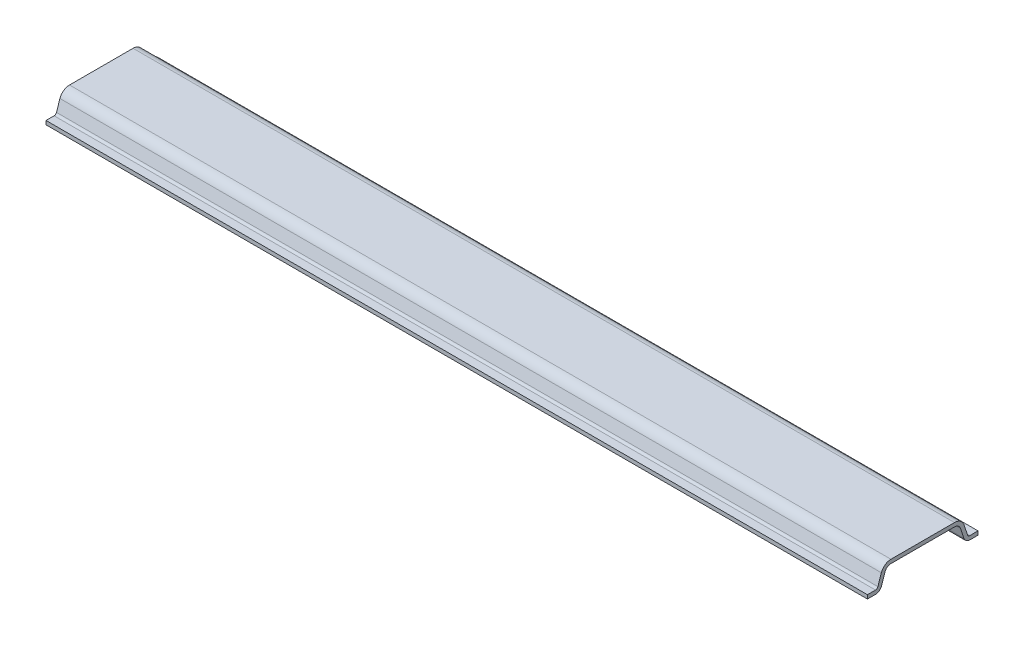
ISO-10303-21;
HEADER;
FILE_DESCRIPTION(('STEP AP214'),'2;1');
FILE_NAME('part.step','',(''),(''),'','','');
FILE_SCHEMA(('AUTOMOTIVE_DESIGN { 1 0 10303 214 1 1 1 1 }'));
ENDSEC;
DATA;
#1=APPLICATION_CONTEXT('core data for automotive mechanical design processes');
#2=APPLICATION_PROTOCOL_DEFINITION('international standard','automotive_design',2000,#1);
#3=PRODUCT_CONTEXT('',#1,'mechanical');
#4=PRODUCT('Part','Part','',(#3));
#5=PRODUCT_RELATED_PRODUCT_CATEGORY('part','',(#4));
#6=PRODUCT_DEFINITION_FORMATION('','',#4);
#7=PRODUCT_DEFINITION_CONTEXT('part definition',#1,'design');
#8=PRODUCT_DEFINITION('design','',#6,#7);
#9=PRODUCT_DEFINITION_SHAPE('','',#8);
#10=(LENGTH_UNIT() NAMED_UNIT(*) SI_UNIT(.MILLI.,.METRE.));
#11=(NAMED_UNIT(*) PLANE_ANGLE_UNIT() SI_UNIT($,.RADIAN.));
#12=(NAMED_UNIT(*) SI_UNIT($,.STERADIAN.) SOLID_ANGLE_UNIT());
#13=UNCERTAINTY_MEASURE_WITH_UNIT(LENGTH_MEASURE(1.E-05),#10,'distance_accuracy_value','');
#14=(GEOMETRIC_REPRESENTATION_CONTEXT(3) GLOBAL_UNCERTAINTY_ASSIGNED_CONTEXT((#13)) GLOBAL_UNIT_ASSIGNED_CONTEXT((#10,
#11,#12)) REPRESENTATION_CONTEXT('',''));
#15=CARTESIAN_POINT('',(0.,0.,0.));
#16=DIRECTION('',(0.,0.,1.));
#17=DIRECTION('',(1.,0.,0.));
#18=AXIS2_PLACEMENT_3D('',#15,#16,#17);
#19=CARTESIAN_POINT('',(130.,1.20000000000001,-17.5));
#20=DIRECTION('',(0.,0.,1.));
#21=DIRECTION('',(1.,0.,0.));
#22=AXIS2_PLACEMENT_3D('',#19,#20,#21);
#23=PLANE('',#22);
#24=DIRECTION('',(0.,1.,0.));
#25=VECTOR('',#24,1.);
#26=CARTESIAN_POINT('',(-130.,1.20000000000001,-17.5));
#27=LINE('',#26,#25);
#28=CARTESIAN_POINT('',(-130.,0.,-17.5));
#29=VERTEX_POINT('',#28);
#30=CARTESIAN_POINT('',(-130.,1.20000000000001,-17.5));
#31=VERTEX_POINT('',#30);
#32=EDGE_CURVE('E203',#29,#31,#27,.T.);
#33=ORIENTED_EDGE('',*,*,#32,.T.);
#34=DIRECTION('',(-1.,0.,0.));
#35=VECTOR('',#34,1.);
#36=CARTESIAN_POINT('',(130.,1.20000000000001,-17.5));
#37=LINE('',#36,#35);
#38=CARTESIAN_POINT('',(130.,1.20000000000001,-17.5));
#39=VERTEX_POINT('',#38);
#40=EDGE_CURVE('E11',#39,#31,#37,.T.);
#41=ORIENTED_EDGE('',*,*,#40,.F.);
#42=DIRECTION('',(0.,1.,0.));
#43=VECTOR('',#42,1.);
#44=CARTESIAN_POINT('',(130.,1.20000000000001,-17.5));
#45=LINE('',#44,#43);
#46=CARTESIAN_POINT('',(130.,0.,-17.5));
#47=VERTEX_POINT('',#46);
#48=EDGE_CURVE('E241',#47,#39,#45,.T.);
#49=ORIENTED_EDGE('',*,*,#48,.F.);
#50=DIRECTION('',(-1.,0.,0.));
#51=VECTOR('',#50,1.);
#52=CARTESIAN_POINT('',(130.,0.,-17.5));
#53=LINE('',#52,#51);
#54=EDGE_CURVE('E199',#47,#29,#53,.T.);
#55=ORIENTED_EDGE('',*,*,#54,.T.);
#56=EDGE_LOOP('',(#33,#41,#49,#55));
#57=FACE_BOUND('',#56,.T.);
#58=ADVANCED_FACE('F35',(#57),#23,.F.);
#59=CARTESIAN_POINT('',(130.,1.20000000000001,-17.5));
#60=DIRECTION('',(0.,-1.,0.));
#61=DIRECTION('',(0.,0.,-1.));
#62=AXIS2_PLACEMENT_3D('',#59,#60,#61);
#63=PLANE('',#62);
#64=DIRECTION('',(0.,0.,1.));
#65=VECTOR('',#64,1.);
#66=CARTESIAN_POINT('',(-130.,1.20000000000001,-17.5));
#67=LINE('',#66,#65);
#68=CARTESIAN_POINT('',(-130.,1.20000000000001,-14.9415184401123));
#69=VERTEX_POINT('',#68);
#70=EDGE_CURVE('E206',#31,#69,#67,.T.);
#71=ORIENTED_EDGE('',*,*,#70,.T.);
#72=DIRECTION('',(-1.,0.,0.));
#73=VECTOR('',#72,1.);
#74=CARTESIAN_POINT('',(130.,1.20000000000001,-14.9415184401123));
#75=LINE('',#74,#73);
#76=CARTESIAN_POINT('',(130.,1.20000000000001,-14.9415184401123));
#77=VERTEX_POINT('',#76);
#78=EDGE_CURVE('E43',#77,#69,#75,.T.);
#79=ORIENTED_EDGE('',*,*,#78,.F.);
#80=DIRECTION('',(0.,0.,1.));
#81=VECTOR('',#80,1.);
#82=CARTESIAN_POINT('',(130.,1.20000000000001,-17.5));
#83=LINE('',#82,#81);
#84=EDGE_CURVE('E130',#39,#77,#83,.T.);
#85=ORIENTED_EDGE('',*,*,#84,.F.);
#86=ORIENTED_EDGE('',*,*,#40,.T.);
#87=EDGE_LOOP('',(#71,#79,#85,#86));
#88=FACE_BOUND('',#87,.T.);
#89=ADVANCED_FACE('F359',(#88),#63,.F.);
#90=CARTESIAN_POINT('',(130.,2.00000000000001,-14.9415184401123));
#91=DIRECTION('',(-1.,0.,0.));
#92=DIRECTION('',(0.,0.,1.));
#93=AXIS2_PLACEMENT_3D('',#90,#91,#92);
#94=CYLINDRICAL_SURFACE('',#93,0.8);
#95=CARTESIAN_POINT('',(-130.,2.00000000000001,-14.9415184401123));
#96=DIRECTION('',(-1.,0.,0.));
#97=DIRECTION('',(0.,0.,1.));
#98=AXIS2_PLACEMENT_3D('',#95,#96,#97);
#99=CIRCLE('',#98,0.8);
#100=CARTESIAN_POINT('',(-130.,1.74701778718654,-14.1825718016718));
#101=VERTEX_POINT('',#100);
#102=EDGE_CURVE('E208',#69,#101,#99,.T.);
#103=ORIENTED_EDGE('',*,*,#102,.T.);
#104=DIRECTION('',(-1.,0.,0.));
#105=VECTOR('',#104,1.);
#106=CARTESIAN_POINT('',(130.,1.74701778718654,-14.1825718016718));
#107=LINE('',#106,#105);
#108=CARTESIAN_POINT('',(130.,1.74701778718654,-14.1825718016718));
#109=VERTEX_POINT('',#108);
#110=EDGE_CURVE('E284',#109,#101,#107,.T.);
#111=ORIENTED_EDGE('',*,*,#110,.F.);
#112=CARTESIAN_POINT('',(130.,2.00000000000001,-14.9415184401123));
#113=DIRECTION('',(-1.,0.,0.));
#114=DIRECTION('',(0.,0.,1.));
#115=AXIS2_PLACEMENT_3D('',#112,#113,#114);
#116=CIRCLE('',#115,0.8);
#117=EDGE_CURVE('E292',#77,#109,#116,.T.);
#118=ORIENTED_EDGE('',*,*,#117,.F.);
#119=ORIENTED_EDGE('',*,*,#78,.T.);
#120=EDGE_LOOP('',(#103,#111,#118,#119));
#121=FACE_BOUND('',#120,.T.);
#122=ADVANCED_FACE('F290',(#121),#94,.F.);
#123=CARTESIAN_POINT('',(130.,1.74701778718654,-14.1825718016718));
#124=DIRECTION('',(0.,-0.316227766016838,0.948683298050514));
#125=DIRECTION('',(0.,-0.948683298050514,-0.316227766016838));
#126=AXIS2_PLACEMENT_3D('',#123,#124,#125);
#127=PLANE('',#126);
#128=DIRECTION('',(0.,0.948683298050514,0.316227766016838));
#129=VECTOR('',#128,1.);
#130=CARTESIAN_POINT('',(-130.,1.74701778718654,-14.1825718016718));
#131=LINE('',#130,#129);
#132=CARTESIAN_POINT('',(-130.,5.01192885125389,-13.0942681136494));
#133=VERTEX_POINT('',#132);
#134=EDGE_CURVE('E210',#101,#133,#131,.T.);
#135=ORIENTED_EDGE('',*,*,#134,.T.);
#136=DIRECTION('',(-1.,0.,0.));
#137=VECTOR('',#136,1.);
#138=CARTESIAN_POINT('',(130.,5.01192885125389,-13.0942681136494));
#139=LINE('',#138,#137);
#140=CARTESIAN_POINT('',(130.,5.01192885125389,-13.0942681136494));
#141=VERTEX_POINT('',#140);
#142=EDGE_CURVE('E281',#141,#133,#139,.T.);
#143=ORIENTED_EDGE('',*,*,#142,.F.);
#144=DIRECTION('',(0.,0.948683298050514,0.316227766016838));
#145=VECTOR('',#144,1.);
#146=CARTESIAN_POINT('',(130.,1.74701778718654,-14.1825718016718));
#147=LINE('',#146,#145);
#148=EDGE_CURVE('E310',#109,#141,#147,.T.);
#149=ORIENTED_EDGE('',*,*,#148,.F.);
#150=ORIENTED_EDGE('',*,*,#110,.T.);
#151=EDGE_LOOP('',(#135,#143,#149,#150));
#152=FACE_BOUND('',#151,.T.);
#153=ADVANCED_FACE('F301',(#152),#127,.F.);
#154=CARTESIAN_POINT('',(130.,4.00000000000001,-10.0584815598877));
#155=DIRECTION('',(-1.,0.,0.));
#156=DIRECTION('',(0.,0.,1.));
#157=AXIS2_PLACEMENT_3D('',#154,#155,#156);
#158=CYLINDRICAL_SURFACE('',#157,3.2);
#159=CARTESIAN_POINT('',(-130.,4.00000000000001,-10.0584815598877));
#160=DIRECTION('',(1.,0.,0.));
#161=DIRECTION('',(0.,0.,-1.));
#162=AXIS2_PLACEMENT_3D('',#159,#160,#161);
#163=CIRCLE('',#162,3.2);
#164=CARTESIAN_POINT('',(-130.,7.20000000000001,-10.0584815598877));
#165=VERTEX_POINT('',#164);
#166=EDGE_CURVE('E212',#133,#165,#163,.T.);
#167=ORIENTED_EDGE('',*,*,#166,.T.);
#168=DIRECTION('',(-1.,0.,0.));
#169=VECTOR('',#168,1.);
#170=CARTESIAN_POINT('',(130.,7.20000000000001,-10.0584815598877));
#171=LINE('',#170,#169);
#172=CARTESIAN_POINT('',(130.,7.20000000000001,-10.0584815598877));
#173=VERTEX_POINT('',#172);
#174=EDGE_CURVE('E278',#173,#165,#171,.T.);
#175=ORIENTED_EDGE('',*,*,#174,.F.);
#176=CARTESIAN_POINT('',(130.,4.00000000000001,-10.0584815598877));
#177=DIRECTION('',(1.,0.,0.));
#178=DIRECTION('',(0.,0.,-1.));
#179=AXIS2_PLACEMENT_3D('',#176,#177,#178);
#180=CIRCLE('',#179,3.2);
#181=EDGE_CURVE('E307',#141,#173,#180,.T.);
#182=ORIENTED_EDGE('',*,*,#181,.F.);
#183=ORIENTED_EDGE('',*,*,#142,.T.);
#184=EDGE_LOOP('',(#167,#175,#182,#183));
#185=FACE_BOUND('',#184,.T.);
#186=ADVANCED_FACE('F305',(#185),#158,.T.);
#187=CARTESIAN_POINT('',(130.,7.20000000000001,-10.0584815598877));
#188=DIRECTION('',(0.,-1.,0.));
#189=DIRECTION('',(0.,0.,-1.));
#190=AXIS2_PLACEMENT_3D('',#187,#188,#189);
#191=PLANE('',#190);
#192=DIRECTION('',(0.,0.,1.));
#193=VECTOR('',#192,1.);
#194=CARTESIAN_POINT('',(-130.,7.20000000000001,-10.0584815598877));
#195=LINE('',#194,#193);
#196=CARTESIAN_POINT('',(-130.,7.2,10.0584815598877));
#197=VERTEX_POINT('',#196);
#198=EDGE_CURVE('E214',#165,#197,#195,.T.);
#199=ORIENTED_EDGE('',*,*,#198,.T.);
#200=DIRECTION('',(-1.,0.,0.));
#201=VECTOR('',#200,1.);
#202=CARTESIAN_POINT('',(130.,7.2,10.0584815598877));
#203=LINE('',#202,#201);
#204=CARTESIAN_POINT('',(130.,7.2,10.0584815598877));
#205=VERTEX_POINT('',#204);
#206=EDGE_CURVE('E275',#205,#197,#203,.T.);
#207=ORIENTED_EDGE('',*,*,#206,.F.);
#208=DIRECTION('',(0.,0.,1.));
#209=VECTOR('',#208,1.);
#210=CARTESIAN_POINT('',(130.,7.20000000000001,-10.0584815598877));
#211=LINE('',#210,#209);
#212=EDGE_CURVE('E309',#173,#205,#211,.T.);
#213=ORIENTED_EDGE('',*,*,#212,.F.);
#214=ORIENTED_EDGE('',*,*,#174,.T.);
#215=EDGE_LOOP('',(#199,#207,#213,#214));
#216=FACE_BOUND('',#215,.T.);
#217=ADVANCED_FACE('F372',(#216),#191,.F.);
#218=CARTESIAN_POINT('',(130.,4.00000000000001,10.0584815598877));
#219=DIRECTION('',(-1.,0.,0.));
#220=DIRECTION('',(0.,0.,1.));
#221=AXIS2_PLACEMENT_3D('',#218,#219,#220);
#222=CYLINDRICAL_SURFACE('',#221,3.2);
#223=CARTESIAN_POINT('',(-130.,4.00000000000001,10.0584815598877));
#224=DIRECTION('',(1.,0.,0.));
#225=DIRECTION('',(0.,0.,1.));
#226=AXIS2_PLACEMENT_3D('',#223,#224,#225);
#227=CIRCLE('',#226,3.2);
#228=CARTESIAN_POINT('',(-130.,5.01192885125389,13.0942681136494));
#229=VERTEX_POINT('',#228);
#230=EDGE_CURVE('E216',#197,#229,#227,.T.);
#231=ORIENTED_EDGE('',*,*,#230,.T.);
#232=DIRECTION('',(-1.,0.,0.));
#233=VECTOR('',#232,1.);
#234=CARTESIAN_POINT('',(130.,5.01192885125389,13.0942681136494));
#235=LINE('',#234,#233);
#236=CARTESIAN_POINT('',(130.,5.01192885125389,13.0942681136494));
#237=VERTEX_POINT('',#236);
#238=EDGE_CURVE('E272',#237,#229,#235,.T.);
#239=ORIENTED_EDGE('',*,*,#238,.F.);
#240=CARTESIAN_POINT('',(130.,4.00000000000001,10.0584815598877));
#241=DIRECTION('',(1.,0.,0.));
#242=DIRECTION('',(0.,0.,1.));
#243=AXIS2_PLACEMENT_3D('',#240,#241,#242);
#244=CIRCLE('',#243,3.2);
#245=EDGE_CURVE('E312',#205,#237,#244,.T.);
#246=ORIENTED_EDGE('',*,*,#245,.F.);
#247=ORIENTED_EDGE('',*,*,#206,.T.);
#248=EDGE_LOOP('',(#231,#239,#246,#247));
#249=FACE_BOUND('',#248,.T.);
#250=ADVANCED_FACE('F375',(#249),#222,.T.);
#251=CARTESIAN_POINT('',(130.,1.74701778718654,14.1825718016718));
#252=DIRECTION('',(0.,-0.316227766016837,-0.948683298050514));
#253=DIRECTION('',(0.,0.948683298050514,-0.316227766016837));
#254=AXIS2_PLACEMENT_3D('',#251,#252,#253);
#255=PLANE('',#254);
#256=DIRECTION('',(0.,-0.948683298050514,0.316227766016837));
#257=VECTOR('',#256,1.);
#258=CARTESIAN_POINT('',(-130.,1.74701778718654,14.1825718016718));
#259=LINE('',#258,#257);
#260=CARTESIAN_POINT('',(-130.,1.74701778718654,14.1825718016718));
#261=VERTEX_POINT('',#260);
#262=EDGE_CURVE('E218',#229,#261,#259,.T.);
#263=ORIENTED_EDGE('',*,*,#262,.T.);
#264=DIRECTION('',(-1.,0.,0.));
#265=VECTOR('',#264,1.);
#266=CARTESIAN_POINT('',(130.,1.74701778718654,14.1825718016718));
#267=LINE('',#266,#265);
#268=CARTESIAN_POINT('',(130.,1.74701778718654,14.1825718016718));
#269=VERTEX_POINT('',#268);
#270=EDGE_CURVE('E269',#269,#261,#267,.T.);
#271=ORIENTED_EDGE('',*,*,#270,.F.);
#272=DIRECTION('',(0.,-0.948683298050514,0.316227766016837));
#273=VECTOR('',#272,1.);
#274=CARTESIAN_POINT('',(130.,1.74701778718654,14.1825718016718));
#275=LINE('',#274,#273);
#276=EDGE_CURVE('E318',#237,#269,#275,.T.);
#277=ORIENTED_EDGE('',*,*,#276,.F.);
#278=ORIENTED_EDGE('',*,*,#238,.T.);
#279=EDGE_LOOP('',(#263,#271,#277,#278));
#280=FACE_BOUND('',#279,.T.);
#281=ADVANCED_FACE('F379',(#280),#255,.F.);
#282=CARTESIAN_POINT('',(130.,2.00000000000001,14.9415184401123));
#283=DIRECTION('',(-1.,0.,0.));
#284=DIRECTION('',(0.,0.,1.));
#285=AXIS2_PLACEMENT_3D('',#282,#283,#284);
#286=CYLINDRICAL_SURFACE('',#285,0.800000000000002);
#287=CARTESIAN_POINT('',(-130.,2.00000000000001,14.9415184401123));
#288=DIRECTION('',(-1.,0.,0.));
#289=DIRECTION('',(0.,0.,-1.));
#290=AXIS2_PLACEMENT_3D('',#287,#288,#289);
#291=CIRCLE('',#290,0.800000000000002);
#292=CARTESIAN_POINT('',(-130.,1.2,14.9415184401123));
#293=VERTEX_POINT('',#292);
#294=EDGE_CURVE('E220',#261,#293,#291,.T.);
#295=ORIENTED_EDGE('',*,*,#294,.T.);
#296=DIRECTION('',(-1.,0.,0.));
#297=VECTOR('',#296,1.);
#298=CARTESIAN_POINT('',(130.,1.2,14.9415184401123));
#299=LINE('',#298,#297);
#300=CARTESIAN_POINT('',(130.,1.2,14.9415184401123));
#301=VERTEX_POINT('',#300);
#302=EDGE_CURVE('E266',#301,#293,#299,.T.);
#303=ORIENTED_EDGE('',*,*,#302,.F.);
#304=CARTESIAN_POINT('',(130.,2.00000000000001,14.9415184401123));
#305=DIRECTION('',(-1.,0.,0.));
#306=DIRECTION('',(0.,0.,-1.));
#307=AXIS2_PLACEMENT_3D('',#304,#305,#306);
#308=CIRCLE('',#307,0.800000000000002);
#309=EDGE_CURVE('E320',#269,#301,#308,.T.);
#310=ORIENTED_EDGE('',*,*,#309,.F.);
#311=ORIENTED_EDGE('',*,*,#270,.T.);
#312=EDGE_LOOP('',(#295,#303,#310,#311));
#313=FACE_BOUND('',#312,.T.);
#314=ADVANCED_FACE('F383',(#313),#286,.F.);
#315=CARTESIAN_POINT('',(130.,1.2,17.5));
#316=DIRECTION('',(0.,-1.,0.));
#317=DIRECTION('',(0.,0.,-1.));
#318=AXIS2_PLACEMENT_3D('',#315,#316,#317);
#319=PLANE('',#318);
#320=DIRECTION('',(0.,0.,1.));
#321=VECTOR('',#320,1.);
#322=CARTESIAN_POINT('',(-130.,1.2,17.5));
#323=LINE('',#322,#321);
#324=CARTESIAN_POINT('',(-130.,1.2,17.5));
#325=VERTEX_POINT('',#324);
#326=EDGE_CURVE('E222',#293,#325,#323,.T.);
#327=ORIENTED_EDGE('',*,*,#326,.T.);
#328=DIRECTION('',(-1.,0.,0.));
#329=VECTOR('',#328,1.);
#330=CARTESIAN_POINT('',(130.,1.2,17.5));
#331=LINE('',#330,#329);
#332=CARTESIAN_POINT('',(130.,1.2,17.5));
#333=VERTEX_POINT('',#332);
#334=EDGE_CURVE('E263',#333,#325,#331,.T.);
#335=ORIENTED_EDGE('',*,*,#334,.F.);
#336=DIRECTION('',(0.,0.,1.));
#337=VECTOR('',#336,1.);
#338=CARTESIAN_POINT('',(130.,1.2,17.5));
#339=LINE('',#338,#337);
#340=EDGE_CURVE('E322',#301,#333,#339,.T.);
#341=ORIENTED_EDGE('',*,*,#340,.F.);
#342=ORIENTED_EDGE('',*,*,#302,.T.);
#343=EDGE_LOOP('',(#327,#335,#341,#342));
#344=FACE_BOUND('',#343,.T.);
#345=ADVANCED_FACE('F387',(#344),#319,.F.);
#346=CARTESIAN_POINT('',(130.,1.2,17.5));
#347=DIRECTION('',(0.,0.,-1.));
#348=DIRECTION('',(-1.,0.,0.));
#349=AXIS2_PLACEMENT_3D('',#346,#347,#348);
#350=PLANE('',#349);
#351=DIRECTION('',(0.,-1.,0.));
#352=VECTOR('',#351,1.);
#353=CARTESIAN_POINT('',(-130.,1.2,17.5));
#354=LINE('',#353,#352);
#355=CARTESIAN_POINT('',(-130.,0.,17.5));
#356=VERTEX_POINT('',#355);
#357=EDGE_CURVE('E224',#325,#356,#354,.T.);
#358=ORIENTED_EDGE('',*,*,#357,.T.);
#359=DIRECTION('',(-1.,0.,0.));
#360=VECTOR('',#359,1.);
#361=CARTESIAN_POINT('',(130.,0.,17.5));
#362=LINE('',#361,#360);
#363=CARTESIAN_POINT('',(130.,0.,17.5));
#364=VERTEX_POINT('',#363);
#365=EDGE_CURVE('E260',#364,#356,#362,.T.);
#366=ORIENTED_EDGE('',*,*,#365,.F.);
#367=DIRECTION('',(0.,-1.,0.));
#368=VECTOR('',#367,1.);
#369=CARTESIAN_POINT('',(130.,1.2,17.5));
#370=LINE('',#369,#368);
#371=EDGE_CURVE('E324',#333,#364,#370,.T.);
#372=ORIENTED_EDGE('',*,*,#371,.F.);
#373=ORIENTED_EDGE('',*,*,#334,.T.);
#374=EDGE_LOOP('',(#358,#366,#372,#373));
#375=FACE_BOUND('',#374,.T.);
#376=ADVANCED_FACE('F391',(#375),#350,.F.);
#377=CARTESIAN_POINT('',(130.,0.,17.5));
#378=DIRECTION('',(0.,1.,0.));
#379=DIRECTION('',(0.,0.,1.));
#380=AXIS2_PLACEMENT_3D('',#377,#378,#379);
#381=PLANE('',#380);
#382=DIRECTION('',(0.,0.,-1.));
#383=VECTOR('',#382,1.);
#384=CARTESIAN_POINT('',(-130.,0.,17.5));
#385=LINE('',#384,#383);
#386=CARTESIAN_POINT('',(-130.,0.,14.9415184401123));
#387=VERTEX_POINT('',#386);
#388=EDGE_CURVE('E226',#356,#387,#385,.T.);
#389=ORIENTED_EDGE('',*,*,#388,.T.);
#390=DIRECTION('',(-1.,0.,0.));
#391=VECTOR('',#390,1.);
#392=CARTESIAN_POINT('',(130.,0.,14.9415184401123));
#393=LINE('',#392,#391);
#394=CARTESIAN_POINT('',(130.,0.,14.9415184401123));
#395=VERTEX_POINT('',#394);
#396=EDGE_CURVE('E257',#395,#387,#393,.T.);
#397=ORIENTED_EDGE('',*,*,#396,.F.);
#398=DIRECTION('',(0.,0.,-1.));
#399=VECTOR('',#398,1.);
#400=CARTESIAN_POINT('',(130.,0.,17.5));
#401=LINE('',#400,#399);
#402=EDGE_CURVE('E326',#364,#395,#401,.T.);
#403=ORIENTED_EDGE('',*,*,#402,.F.);
#404=ORIENTED_EDGE('',*,*,#365,.T.);
#405=EDGE_LOOP('',(#389,#397,#403,#404));
#406=FACE_BOUND('',#405,.T.);
#407=ADVANCED_FACE('F395',(#406),#381,.F.);
#408=CARTESIAN_POINT('',(130.,2.00000000000001,14.9415184401123));
#409=DIRECTION('',(-1.,0.,0.));
#410=DIRECTION('',(0.,0.,1.));
#411=AXIS2_PLACEMENT_3D('',#408,#409,#410);
#412=CYLINDRICAL_SURFACE('',#411,2.);
#413=CARTESIAN_POINT('',(-130.,2.00000000000001,14.9415184401123));
#414=DIRECTION('',(1.,0.,0.));
#415=DIRECTION('',(0.,0.,-1.));
#416=AXIS2_PLACEMENT_3D('',#413,#414,#415);
#417=CIRCLE('',#416,2.);
#418=CARTESIAN_POINT('',(-130.,1.36754446796633,13.0441518440112));
#419=VERTEX_POINT('',#418);
#420=EDGE_CURVE('E228',#387,#419,#417,.T.);
#421=ORIENTED_EDGE('',*,*,#420,.T.);
#422=DIRECTION('',(-1.,0.,0.));
#423=VECTOR('',#422,1.);
#424=CARTESIAN_POINT('',(130.,1.36754446796633,13.0441518440112));
#425=LINE('',#424,#423);
#426=CARTESIAN_POINT('',(130.,1.36754446796633,13.0441518440112));
#427=VERTEX_POINT('',#426);
#428=EDGE_CURVE('E254',#427,#419,#425,.T.);
#429=ORIENTED_EDGE('',*,*,#428,.F.);
#430=CARTESIAN_POINT('',(130.,2.00000000000001,14.9415184401123));
#431=DIRECTION('',(1.,0.,0.));
#432=DIRECTION('',(0.,0.,-1.));
#433=AXIS2_PLACEMENT_3D('',#430,#431,#432);
#434=CIRCLE('',#433,2.);
#435=EDGE_CURVE('E328',#395,#427,#434,.T.);
#436=ORIENTED_EDGE('',*,*,#435,.F.);
#437=ORIENTED_EDGE('',*,*,#396,.T.);
#438=EDGE_LOOP('',(#421,#429,#436,#437));
#439=FACE_BOUND('',#438,.T.);
#440=ADVANCED_FACE('F399',(#439),#412,.T.);
#441=CARTESIAN_POINT('',(130.,1.36754446796633,13.0441518440112));
#442=DIRECTION('',(0.,0.316227766016837,0.948683298050514));
#443=DIRECTION('',(0.,-0.948683298050514,0.316227766016837));
#444=AXIS2_PLACEMENT_3D('',#441,#442,#443);
#445=PLANE('',#444);
#446=DIRECTION('',(0.,0.948683298050514,-0.316227766016837));
#447=VECTOR('',#446,1.);
#448=CARTESIAN_POINT('',(-130.,1.36754446796633,13.0441518440112));
#449=LINE('',#448,#447);
#450=CARTESIAN_POINT('',(-130.,4.63245553203368,11.9558481559888));
#451=VERTEX_POINT('',#450);
#452=EDGE_CURVE('E230',#419,#451,#449,.T.);
#453=ORIENTED_EDGE('',*,*,#452,.T.);
#454=DIRECTION('',(-1.,0.,0.));
#455=VECTOR('',#454,1.);
#456=CARTESIAN_POINT('',(130.,4.63245553203368,11.9558481559888));
#457=LINE('',#456,#455);
#458=CARTESIAN_POINT('',(130.,4.63245553203368,11.9558481559888));
#459=VERTEX_POINT('',#458);
#460=EDGE_CURVE('E251',#459,#451,#457,.T.);
#461=ORIENTED_EDGE('',*,*,#460,.F.);
#462=DIRECTION('',(0.,0.948683298050514,-0.316227766016837));
#463=VECTOR('',#462,1.);
#464=CARTESIAN_POINT('',(130.,1.36754446796633,13.0441518440112));
#465=LINE('',#464,#463);
#466=EDGE_CURVE('E330',#427,#459,#465,.T.);
#467=ORIENTED_EDGE('',*,*,#466,.F.);
#468=ORIENTED_EDGE('',*,*,#428,.T.);
#469=EDGE_LOOP('',(#453,#461,#467,#468));
#470=FACE_BOUND('',#469,.T.);
#471=ADVANCED_FACE('F403',(#470),#445,.F.);
#472=CARTESIAN_POINT('',(130.,4.00000000000001,10.0584815598877));
#473=DIRECTION('',(-1.,0.,0.));
#474=DIRECTION('',(0.,0.,1.));
#475=AXIS2_PLACEMENT_3D('',#472,#473,#474);
#476=CYLINDRICAL_SURFACE('',#475,2.);
#477=CARTESIAN_POINT('',(-130.,4.00000000000001,10.0584815598877));
#478=DIRECTION('',(-1.,0.,0.));
#479=DIRECTION('',(0.,0.,1.));
#480=AXIS2_PLACEMENT_3D('',#477,#478,#479);
#481=CIRCLE('',#480,2.);
#482=CARTESIAN_POINT('',(-130.,6.00000000000001,10.0584815598877));
#483=VERTEX_POINT('',#482);
#484=EDGE_CURVE('E232',#451,#483,#481,.T.);
#485=ORIENTED_EDGE('',*,*,#484,.T.);
#486=DIRECTION('',(-1.,0.,0.));
#487=VECTOR('',#486,1.);
#488=CARTESIAN_POINT('',(130.,6.00000000000001,10.0584815598877));
#489=LINE('',#488,#487);
#490=CARTESIAN_POINT('',(130.,6.00000000000001,10.0584815598877));
#491=VERTEX_POINT('',#490);
#492=EDGE_CURVE('E248',#491,#483,#489,.T.);
#493=ORIENTED_EDGE('',*,*,#492,.F.);
#494=CARTESIAN_POINT('',(130.,4.00000000000001,10.0584815598877));
#495=DIRECTION('',(-1.,0.,0.));
#496=DIRECTION('',(0.,0.,1.));
#497=AXIS2_PLACEMENT_3D('',#494,#495,#496);
#498=CIRCLE('',#497,2.);
#499=EDGE_CURVE('E332',#459,#491,#498,.T.);
#500=ORIENTED_EDGE('',*,*,#499,.F.);
#501=ORIENTED_EDGE('',*,*,#460,.T.);
#502=EDGE_LOOP('',(#485,#493,#500,#501));
#503=FACE_BOUND('',#502,.T.);
#504=ADVANCED_FACE('F407',(#503),#476,.F.);
#505=CARTESIAN_POINT('',(130.,6.00000000000001,-10.0584815598877));
#506=DIRECTION('',(0.,1.,0.));
#507=DIRECTION('',(0.,0.,1.));
#508=AXIS2_PLACEMENT_3D('',#505,#506,#507);
#509=PLANE('',#508);
#510=DIRECTION('',(0.,0.,-1.));
#511=VECTOR('',#510,1.);
#512=CARTESIAN_POINT('',(-130.,6.00000000000001,-10.0584815598877));
#513=LINE('',#512,#511);
#514=CARTESIAN_POINT('',(-130.,6.00000000000001,-10.0584815598877));
#515=VERTEX_POINT('',#514);
#516=EDGE_CURVE('E234',#483,#515,#513,.T.);
#517=ORIENTED_EDGE('',*,*,#516,.T.);
#518=DIRECTION('',(-1.,0.,0.));
#519=VECTOR('',#518,1.);
#520=CARTESIAN_POINT('',(130.,6.00000000000001,-10.0584815598877));
#521=LINE('',#520,#519);
#522=CARTESIAN_POINT('',(130.,6.00000000000001,-10.0584815598877));
#523=VERTEX_POINT('',#522);
#524=EDGE_CURVE('E245',#523,#515,#521,.T.);
#525=ORIENTED_EDGE('',*,*,#524,.F.);
#526=DIRECTION('',(0.,0.,-1.));
#527=VECTOR('',#526,1.);
#528=CARTESIAN_POINT('',(130.,6.00000000000001,-10.0584815598877));
#529=LINE('',#528,#527);
#530=EDGE_CURVE('E334',#491,#523,#529,.T.);
#531=ORIENTED_EDGE('',*,*,#530,.F.);
#532=ORIENTED_EDGE('',*,*,#492,.T.);
#533=EDGE_LOOP('',(#517,#525,#531,#532));
#534=FACE_BOUND('',#533,.T.);
#535=ADVANCED_FACE('F340',(#534),#509,.F.);
#536=CARTESIAN_POINT('',(130.,4.00000000000001,-10.0584815598877));
#537=DIRECTION('',(-1.,0.,0.));
#538=DIRECTION('',(0.,0.,1.));
#539=AXIS2_PLACEMENT_3D('',#536,#537,#538);
#540=CYLINDRICAL_SURFACE('',#539,2.);
#541=CARTESIAN_POINT('',(-130.,4.00000000000001,-10.0584815598877));
#542=DIRECTION('',(-1.,0.,0.));
#543=DIRECTION('',(0.,0.,-1.));
#544=AXIS2_PLACEMENT_3D('',#541,#542,#543);
#545=CIRCLE('',#544,2.);
#546=CARTESIAN_POINT('',(-130.,4.63245553203368,-11.9558481559888));
#547=VERTEX_POINT('',#546);
#548=EDGE_CURVE('E236',#515,#547,#545,.T.);
#549=ORIENTED_EDGE('',*,*,#548,.T.);
#550=DIRECTION('',(-1.,0.,0.));
#551=VECTOR('',#550,1.);
#552=CARTESIAN_POINT('',(130.,4.63245553203368,-11.9558481559888));
#553=LINE('',#552,#551);
#554=CARTESIAN_POINT('',(130.,4.63245553203368,-11.9558481559888));
#555=VERTEX_POINT('',#554);
#556=EDGE_CURVE('E194',#555,#547,#553,.T.);
#557=ORIENTED_EDGE('',*,*,#556,.F.);
#558=CARTESIAN_POINT('',(130.,4.00000000000001,-10.0584815598877));
#559=DIRECTION('',(-1.,0.,0.));
#560=DIRECTION('',(0.,0.,-1.));
#561=AXIS2_PLACEMENT_3D('',#558,#559,#560);
#562=CIRCLE('',#561,2.);
#563=EDGE_CURVE('E185',#523,#555,#562,.T.);
#564=ORIENTED_EDGE('',*,*,#563,.F.);
#565=ORIENTED_EDGE('',*,*,#524,.T.);
#566=EDGE_LOOP('',(#549,#557,#564,#565));
#567=FACE_BOUND('',#566,.T.);
#568=ADVANCED_FACE('F344',(#567),#540,.F.);
#569=CARTESIAN_POINT('',(130.,1.36754446796633,-13.0441518440112));
#570=DIRECTION('',(0.,0.316227766016837,-0.948683298050514));
#571=DIRECTION('',(0.,0.948683298050514,0.316227766016837));
#572=AXIS2_PLACEMENT_3D('',#569,#570,#571);
#573=PLANE('',#572);
#574=DIRECTION('',(0.,-0.948683298050514,-0.316227766016837));
#575=VECTOR('',#574,1.);
#576=CARTESIAN_POINT('',(-130.,1.36754446796633,-13.0441518440112));
#577=LINE('',#576,#575);
#578=CARTESIAN_POINT('',(-130.,1.36754446796633,-13.0441518440112));
#579=VERTEX_POINT('',#578);
#580=EDGE_CURVE('E193',#547,#579,#577,.T.);
#581=ORIENTED_EDGE('',*,*,#580,.T.);
#582=DIRECTION('',(-1.,0.,0.));
#583=VECTOR('',#582,1.);
#584=CARTESIAN_POINT('',(130.,1.36754446796633,-13.0441518440112));
#585=LINE('',#584,#583);
#586=CARTESIAN_POINT('',(130.,1.36754446796633,-13.0441518440112));
#587=VERTEX_POINT('',#586);
#588=EDGE_CURVE('E190',#587,#579,#585,.T.);
#589=ORIENTED_EDGE('',*,*,#588,.F.);
#590=DIRECTION('',(0.,-0.948683298050514,-0.316227766016837));
#591=VECTOR('',#590,1.);
#592=CARTESIAN_POINT('',(130.,1.36754446796633,-13.0441518440112));
#593=LINE('',#592,#591);
#594=EDGE_CURVE('E179',#555,#587,#593,.T.);
#595=ORIENTED_EDGE('',*,*,#594,.F.);
#596=ORIENTED_EDGE('',*,*,#556,.T.);
#597=EDGE_LOOP('',(#581,#589,#595,#596));
#598=FACE_BOUND('',#597,.T.);
#599=ADVANCED_FACE('F191',(#598),#573,.F.);
#600=CARTESIAN_POINT('',(130.,2.00000000000001,-14.9415184401123));
#601=DIRECTION('',(-1.,0.,0.));
#602=DIRECTION('',(0.,0.,1.));
#603=AXIS2_PLACEMENT_3D('',#600,#601,#602);
#604=CYLINDRICAL_SURFACE('',#603,2.);
#605=CARTESIAN_POINT('',(-130.,2.00000000000001,-14.9415184401123));
#606=DIRECTION('',(1.,0.,0.));
#607=DIRECTION('',(0.,0.,1.));
#608=AXIS2_PLACEMENT_3D('',#605,#606,#607);
#609=CIRCLE('',#608,2.);
#610=CARTESIAN_POINT('',(-130.,0.,-14.9415184401123));
#611=VERTEX_POINT('',#610);
#612=EDGE_CURVE('E116',#579,#611,#609,.T.);
#613=ORIENTED_EDGE('',*,*,#612,.T.);
#614=DIRECTION('',(-1.,0.,0.));
#615=VECTOR('',#614,1.);
#616=CARTESIAN_POINT('',(130.,0.,-14.9415184401123));
#617=LINE('',#616,#615);
#618=CARTESIAN_POINT('',(130.,0.,-14.9415184401123));
#619=VERTEX_POINT('',#618);
#620=EDGE_CURVE('E195',#619,#611,#617,.T.);
#621=ORIENTED_EDGE('',*,*,#620,.F.);
#622=CARTESIAN_POINT('',(130.,2.00000000000001,-14.9415184401123));
#623=DIRECTION('',(1.,0.,0.));
#624=DIRECTION('',(0.,0.,1.));
#625=AXIS2_PLACEMENT_3D('',#622,#623,#624);
#626=CIRCLE('',#625,2.);
#627=EDGE_CURVE('E183',#587,#619,#626,.T.);
#628=ORIENTED_EDGE('',*,*,#627,.F.);
#629=ORIENTED_EDGE('',*,*,#588,.T.);
#630=EDGE_LOOP('',(#613,#621,#628,#629));
#631=FACE_BOUND('',#630,.T.);
#632=ADVANCED_FACE('F197',(#631),#604,.T.);
#633=CARTESIAN_POINT('',(130.,0.,-17.5));
#634=DIRECTION('',(0.,1.,0.));
#635=DIRECTION('',(0.,0.,1.));
#636=AXIS2_PLACEMENT_3D('',#633,#634,#635);
#637=PLANE('',#636);
#638=DIRECTION('',(0.,0.,-1.));
#639=VECTOR('',#638,1.);
#640=CARTESIAN_POINT('',(-130.,0.,-17.5));
#641=LINE('',#640,#639);
#642=EDGE_CURVE('E122',#611,#29,#641,.T.);
#643=ORIENTED_EDGE('',*,*,#642,.T.);
#644=ORIENTED_EDGE('',*,*,#54,.F.);
#645=DIRECTION('',(0.,0.,-1.));
#646=VECTOR('',#645,1.);
#647=CARTESIAN_POINT('',(130.,0.,-17.5));
#648=LINE('',#647,#646);
#649=EDGE_CURVE('E51',#619,#47,#648,.T.);
#650=ORIENTED_EDGE('',*,*,#649,.F.);
#651=ORIENTED_EDGE('',*,*,#620,.T.);
#652=EDGE_LOOP('',(#643,#644,#650,#651));
#653=FACE_BOUND('',#652,.T.);
#654=ADVANCED_FACE('F348',(#653),#637,.F.);
#655=CARTESIAN_POINT('',(130.,2.00000000000001,-14.9415184401123));
#656=DIRECTION('',(-1.,0.,0.));
#657=DIRECTION('',(0.,0.,1.));
#658=AXIS2_PLACEMENT_3D('',#655,#656,#657);
#659=PLANE('',#658);
#660=ORIENTED_EDGE('',*,*,#48,.T.);
#661=ORIENTED_EDGE('',*,*,#84,.T.);
#662=ORIENTED_EDGE('',*,*,#117,.T.);
#663=ORIENTED_EDGE('',*,*,#148,.T.);
#664=ORIENTED_EDGE('',*,*,#181,.T.);
#665=ORIENTED_EDGE('',*,*,#212,.T.);
#666=ORIENTED_EDGE('',*,*,#245,.T.);
#667=ORIENTED_EDGE('',*,*,#276,.T.);
#668=ORIENTED_EDGE('',*,*,#309,.T.);
#669=ORIENTED_EDGE('',*,*,#340,.T.);
#670=ORIENTED_EDGE('',*,*,#371,.T.);
#671=ORIENTED_EDGE('',*,*,#402,.T.);
#672=ORIENTED_EDGE('',*,*,#435,.T.);
#673=ORIENTED_EDGE('',*,*,#466,.T.);
#674=ORIENTED_EDGE('',*,*,#499,.T.);
#675=ORIENTED_EDGE('',*,*,#530,.T.);
#676=ORIENTED_EDGE('',*,*,#563,.T.);
#677=ORIENTED_EDGE('',*,*,#594,.T.);
#678=ORIENTED_EDGE('',*,*,#627,.T.);
#679=ORIENTED_EDGE('',*,*,#649,.T.);
#680=EDGE_LOOP('',(#660,#661,#662,#663,#664,#665,#666,#667,#668,#669,#670,#671,#672,#673,#674,
#675,#676,#677,#678,#679));
#681=FACE_BOUND('',#680,.T.);
#682=ADVANCED_FACE('F181',(#681),#659,.F.);
#683=CARTESIAN_POINT('',(-130.,2.00000000000001,-14.9415184401123));
#684=DIRECTION('',(-1.,0.,0.));
#685=DIRECTION('',(0.,0.,1.));
#686=AXIS2_PLACEMENT_3D('',#683,#684,#685);
#687=PLANE('',#686);
#688=ORIENTED_EDGE('',*,*,#32,.F.);
#689=ORIENTED_EDGE('',*,*,#642,.F.);
#690=ORIENTED_EDGE('',*,*,#612,.F.);
#691=ORIENTED_EDGE('',*,*,#580,.F.);
#692=ORIENTED_EDGE('',*,*,#548,.F.);
#693=ORIENTED_EDGE('',*,*,#516,.F.);
#694=ORIENTED_EDGE('',*,*,#484,.F.);
#695=ORIENTED_EDGE('',*,*,#452,.F.);
#696=ORIENTED_EDGE('',*,*,#420,.F.);
#697=ORIENTED_EDGE('',*,*,#388,.F.);
#698=ORIENTED_EDGE('',*,*,#357,.F.);
#699=ORIENTED_EDGE('',*,*,#326,.F.);
#700=ORIENTED_EDGE('',*,*,#294,.F.);
#701=ORIENTED_EDGE('',*,*,#262,.F.);
#702=ORIENTED_EDGE('',*,*,#230,.F.);
#703=ORIENTED_EDGE('',*,*,#198,.F.);
#704=ORIENTED_EDGE('',*,*,#166,.F.);
#705=ORIENTED_EDGE('',*,*,#134,.F.);
#706=ORIENTED_EDGE('',*,*,#102,.F.);
#707=ORIENTED_EDGE('',*,*,#70,.F.);
#708=EDGE_LOOP('',(#688,#689,#690,#691,#692,#693,#694,#695,#696,#697,#698,#699,#700,#701,#702,
#703,#704,#705,#706,#707));
#709=FACE_BOUND('',#708,.T.);
#710=ADVANCED_FACE('F296',(#709),#687,.T.);
#711=CLOSED_SHELL('',(#58,#89,#122,#153,#186,#217,#250,#281,#314,#345,#376,#407,#440,#471,#504,
#535,#568,#599,#632,#654,#682,#710));
#712=MANIFOLD_SOLID_BREP('B2',#711);
#713=ADVANCED_BREP_SHAPE_REPRESENTATION('',(#18,#712),#14);
#714=SHAPE_DEFINITION_REPRESENTATION(#9,#713);
ENDSEC;
END-ISO-10303-21;
